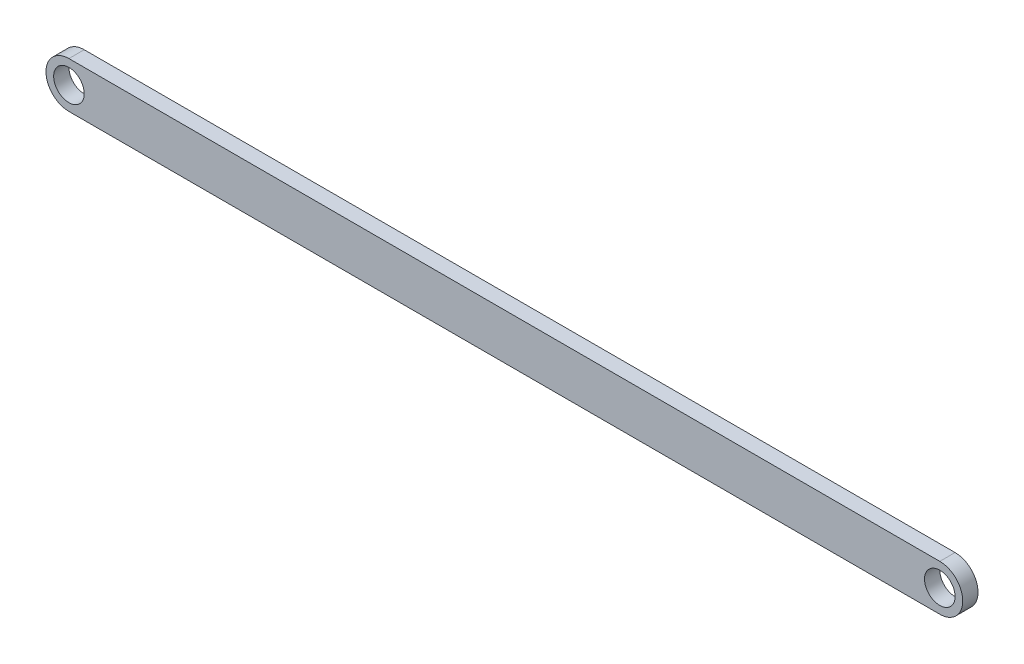
ISO-10303-21;
HEADER;
FILE_DESCRIPTION(('STEP AP214'),'2;1');
FILE_NAME('part.step','',(''),(''),'','','');
FILE_SCHEMA(('AUTOMOTIVE_DESIGN { 1 0 10303 214 1 1 1 1 }'));
ENDSEC;
DATA;
#1=APPLICATION_CONTEXT('core data for automotive mechanical design processes');
#2=APPLICATION_PROTOCOL_DEFINITION('international standard','automotive_design',2000,#1);
#3=PRODUCT_CONTEXT('',#1,'mechanical');
#4=PRODUCT('Part','Part','',(#3));
#5=PRODUCT_RELATED_PRODUCT_CATEGORY('part','',(#4));
#6=PRODUCT_DEFINITION_FORMATION('','',#4);
#7=PRODUCT_DEFINITION_CONTEXT('part definition',#1,'design');
#8=PRODUCT_DEFINITION('design','',#6,#7);
#9=PRODUCT_DEFINITION_SHAPE('','',#8);
#10=(LENGTH_UNIT() NAMED_UNIT(*) SI_UNIT(.MILLI.,.METRE.));
#11=(NAMED_UNIT(*) PLANE_ANGLE_UNIT() SI_UNIT($,.RADIAN.));
#12=(NAMED_UNIT(*) SI_UNIT($,.STERADIAN.) SOLID_ANGLE_UNIT());
#13=UNCERTAINTY_MEASURE_WITH_UNIT(LENGTH_MEASURE(1.E-05),#10,'distance_accuracy_value','');
#14=(GEOMETRIC_REPRESENTATION_CONTEXT(3) GLOBAL_UNCERTAINTY_ASSIGNED_CONTEXT((#13)) GLOBAL_UNIT_ASSIGNED_CONTEXT((#10,
#11,#12)) REPRESENTATION_CONTEXT('',''));
#15=CARTESIAN_POINT('',(0.,0.,0.));
#16=DIRECTION('',(0.,0.,1.));
#17=DIRECTION('',(1.,0.,0.));
#18=AXIS2_PLACEMENT_3D('',#15,#16,#17);
#19=CARTESIAN_POINT('',(0.,0.,10.));
#20=DIRECTION('',(0.,0.,1.));
#21=DIRECTION('',(1.,0.,0.));
#22=AXIS2_PLACEMENT_3D('',#19,#20,#21);
#23=PLANE('',#22);
#24=CARTESIAN_POINT('',(0.,0.,10.));
#25=DIRECTION('',(0.,0.,1.));
#26=DIRECTION('',(1.,0.,0.));
#27=AXIS2_PLACEMENT_3D('',#24,#25,#26);
#28=CIRCLE('',#27,10.);
#29=CARTESIAN_POINT('',(10.,0.,10.));
#30=VERTEX_POINT('',#29);
#31=EDGE_CURVE('E118',#30,#30,#28,.T.);
#32=ORIENTED_EDGE('',*,*,#31,.F.);
#33=EDGE_LOOP('',(#32));
#34=FACE_BOUND('',#33,.T.);
#35=CARTESIAN_POINT('',(0.,0.,10.));
#36=DIRECTION('',(0.,0.,1.));
#37=DIRECTION('',(1.,0.,0.));
#38=AXIS2_PLACEMENT_3D('',#35,#36,#37);
#39=CIRCLE('',#38,15.);
#40=CARTESIAN_POINT('',(0.,15.,10.));
#41=VERTEX_POINT('',#40);
#42=CARTESIAN_POINT('',(0.,-15.,10.));
#43=VERTEX_POINT('',#42);
#44=EDGE_CURVE('E98',#41,#43,#39,.T.);
#45=ORIENTED_EDGE('',*,*,#44,.T.);
#46=DIRECTION('',(1.,0.,0.));
#47=VECTOR('',#46,1.);
#48=CARTESIAN_POINT('',(0.,-15.,10.));
#49=LINE('',#48,#47);
#50=CARTESIAN_POINT('',(570.,-15.,10.));
#51=VERTEX_POINT('',#50);
#52=EDGE_CURVE('E93',#43,#51,#49,.T.);
#53=ORIENTED_EDGE('',*,*,#52,.T.);
#54=CARTESIAN_POINT('',(570.,0.,10.));
#55=DIRECTION('',(0.,0.,1.));
#56=DIRECTION('',(1.,0.,0.));
#57=AXIS2_PLACEMENT_3D('',#54,#55,#56);
#58=CIRCLE('',#57,15.);
#59=CARTESIAN_POINT('',(570.,15.,10.));
#60=VERTEX_POINT('',#59);
#61=EDGE_CURVE('E96',#51,#60,#58,.T.);
#62=ORIENTED_EDGE('',*,*,#61,.T.);
#63=DIRECTION('',(-1.,0.,0.));
#64=VECTOR('',#63,1.);
#65=CARTESIAN_POINT('',(0.,15.,10.));
#66=LINE('',#65,#64);
#67=EDGE_CURVE('E63',#60,#41,#66,.T.);
#68=ORIENTED_EDGE('',*,*,#67,.T.);
#69=EDGE_LOOP('',(#45,#53,#62,#68));
#70=FACE_BOUND('',#69,.T.);
#71=CARTESIAN_POINT('',(570.,0.,10.));
#72=DIRECTION('',(0.,0.,1.));
#73=DIRECTION('',(1.,0.,0.));
#74=AXIS2_PLACEMENT_3D('',#71,#72,#73);
#75=CIRCLE('',#74,9.99999999999998);
#76=CARTESIAN_POINT('',(580.,0.,10.));
#77=VERTEX_POINT('',#76);
#78=EDGE_CURVE('E140',#77,#77,#75,.T.);
#79=ORIENTED_EDGE('',*,*,#78,.F.);
#80=EDGE_LOOP('',(#79));
#81=FACE_BOUND('',#80,.T.);
#82=ADVANCED_FACE('F45',(#34,#70,#81),#23,.T.);
#83=CARTESIAN_POINT('',(0.,0.,0.));
#84=DIRECTION('',(0.,0.,1.));
#85=DIRECTION('',(1.,0.,0.));
#86=AXIS2_PLACEMENT_3D('',#83,#84,#85);
#87=PLANE('',#86);
#88=CARTESIAN_POINT('',(0.,0.,0.));
#89=DIRECTION('',(0.,0.,1.));
#90=DIRECTION('',(1.,0.,0.));
#91=AXIS2_PLACEMENT_3D('',#88,#89,#90);
#92=CIRCLE('',#91,15.);
#93=CARTESIAN_POINT('',(0.,15.,0.));
#94=VERTEX_POINT('',#93);
#95=CARTESIAN_POINT('',(0.,-15.,0.));
#96=VERTEX_POINT('',#95);
#97=EDGE_CURVE('E114',#94,#96,#92,.T.);
#98=ORIENTED_EDGE('',*,*,#97,.F.);
#99=DIRECTION('',(-1.,0.,0.));
#100=VECTOR('',#99,1.);
#101=CARTESIAN_POINT('',(0.,15.,0.));
#102=LINE('',#101,#100);
#103=CARTESIAN_POINT('',(570.,15.,0.));
#104=VERTEX_POINT('',#103);
#105=EDGE_CURVE('E86',#104,#94,#102,.T.);
#106=ORIENTED_EDGE('',*,*,#105,.F.);
#107=CARTESIAN_POINT('',(570.,0.,0.));
#108=DIRECTION('',(0.,0.,1.));
#109=DIRECTION('',(1.,0.,0.));
#110=AXIS2_PLACEMENT_3D('',#107,#108,#109);
#111=CIRCLE('',#110,15.);
#112=CARTESIAN_POINT('',(570.,-15.,0.));
#113=VERTEX_POINT('',#112);
#114=EDGE_CURVE('E80',#113,#104,#111,.T.);
#115=ORIENTED_EDGE('',*,*,#114,.F.);
#116=DIRECTION('',(1.,0.,0.));
#117=VECTOR('',#116,1.);
#118=CARTESIAN_POINT('',(0.,-15.,0.));
#119=LINE('',#118,#117);
#120=EDGE_CURVE('E103',#96,#113,#119,.T.);
#121=ORIENTED_EDGE('',*,*,#120,.F.);
#122=EDGE_LOOP('',(#98,#106,#115,#121));
#123=FACE_BOUND('',#122,.T.);
#124=CARTESIAN_POINT('',(0.,0.,0.));
#125=DIRECTION('',(0.,0.,1.));
#126=DIRECTION('',(1.,0.,0.));
#127=AXIS2_PLACEMENT_3D('',#124,#125,#126);
#128=CIRCLE('',#127,10.);
#129=CARTESIAN_POINT('',(10.,0.,0.));
#130=VERTEX_POINT('',#129);
#131=EDGE_CURVE('E136',#130,#130,#128,.T.);
#132=ORIENTED_EDGE('',*,*,#131,.T.);
#133=EDGE_LOOP('',(#132));
#134=FACE_BOUND('',#133,.T.);
#135=CARTESIAN_POINT('',(570.,0.,0.));
#136=DIRECTION('',(0.,0.,1.));
#137=DIRECTION('',(1.,0.,0.));
#138=AXIS2_PLACEMENT_3D('',#135,#136,#137);
#139=CIRCLE('',#138,9.99999999999998);
#140=CARTESIAN_POINT('',(580.,0.,0.));
#141=VERTEX_POINT('',#140);
#142=EDGE_CURVE('E144',#141,#141,#139,.T.);
#143=ORIENTED_EDGE('',*,*,#142,.T.);
#144=EDGE_LOOP('',(#143));
#145=FACE_BOUND('',#144,.T.);
#146=ADVANCED_FACE('F131',(#123,#134,#145),#87,.F.);
#147=CARTESIAN_POINT('',(0.,0.,10.));
#148=DIRECTION('',(0.,0.,-1.));
#149=DIRECTION('',(-1.,0.,0.));
#150=AXIS2_PLACEMENT_3D('',#147,#148,#149);
#151=CYLINDRICAL_SURFACE('',#150,15.);
#152=ORIENTED_EDGE('',*,*,#97,.T.);
#153=DIRECTION('',(0.,0.,-1.));
#154=VECTOR('',#153,1.);
#155=CARTESIAN_POINT('',(0.,-15.,10.));
#156=LINE('',#155,#154);
#157=EDGE_CURVE('E11',#43,#96,#156,.T.);
#158=ORIENTED_EDGE('',*,*,#157,.F.);
#159=ORIENTED_EDGE('',*,*,#44,.F.);
#160=DIRECTION('',(0.,0.,-1.));
#161=VECTOR('',#160,1.);
#162=CARTESIAN_POINT('',(0.,15.,10.));
#163=LINE('',#162,#161);
#164=EDGE_CURVE('E110',#41,#94,#163,.T.);
#165=ORIENTED_EDGE('',*,*,#164,.T.);
#166=EDGE_LOOP('',(#152,#158,#159,#165));
#167=FACE_BOUND('',#166,.T.);
#168=ADVANCED_FACE('F47',(#167),#151,.T.);
#169=CARTESIAN_POINT('',(0.,-15.,10.));
#170=DIRECTION('',(0.,1.,0.));
#171=DIRECTION('',(0.,0.,1.));
#172=AXIS2_PLACEMENT_3D('',#169,#170,#171);
#173=PLANE('',#172);
#174=ORIENTED_EDGE('',*,*,#120,.T.);
#175=DIRECTION('',(0.,0.,-1.));
#176=VECTOR('',#175,1.);
#177=CARTESIAN_POINT('',(570.,-15.,10.));
#178=LINE('',#177,#176);
#179=EDGE_CURVE('E55',#51,#113,#178,.T.);
#180=ORIENTED_EDGE('',*,*,#179,.F.);
#181=ORIENTED_EDGE('',*,*,#52,.F.);
#182=ORIENTED_EDGE('',*,*,#157,.T.);
#183=EDGE_LOOP('',(#174,#180,#181,#182));
#184=FACE_BOUND('',#183,.T.);
#185=ADVANCED_FACE('F102',(#184),#173,.F.);
#186=CARTESIAN_POINT('',(570.,0.,10.));
#187=DIRECTION('',(0.,0.,-1.));
#188=DIRECTION('',(-1.,0.,0.));
#189=AXIS2_PLACEMENT_3D('',#186,#187,#188);
#190=CYLINDRICAL_SURFACE('',#189,15.);
#191=ORIENTED_EDGE('',*,*,#114,.T.);
#192=DIRECTION('',(0.,0.,-1.));
#193=VECTOR('',#192,1.);
#194=CARTESIAN_POINT('',(570.,15.,10.));
#195=LINE('',#194,#193);
#196=EDGE_CURVE('E105',#60,#104,#195,.T.);
#197=ORIENTED_EDGE('',*,*,#196,.F.);
#198=ORIENTED_EDGE('',*,*,#61,.F.);
#199=ORIENTED_EDGE('',*,*,#179,.T.);
#200=EDGE_LOOP('',(#191,#197,#198,#199));
#201=FACE_BOUND('',#200,.T.);
#202=ADVANCED_FACE('F106',(#201),#190,.T.);
#203=CARTESIAN_POINT('',(0.,15.,10.));
#204=DIRECTION('',(0.,-1.,0.));
#205=DIRECTION('',(0.,0.,-1.));
#206=AXIS2_PLACEMENT_3D('',#203,#204,#205);
#207=PLANE('',#206);
#208=ORIENTED_EDGE('',*,*,#105,.T.);
#209=ORIENTED_EDGE('',*,*,#164,.F.);
#210=ORIENTED_EDGE('',*,*,#67,.F.);
#211=ORIENTED_EDGE('',*,*,#196,.T.);
#212=EDGE_LOOP('',(#208,#209,#210,#211));
#213=FACE_BOUND('',#212,.T.);
#214=ADVANCED_FACE('F128',(#213),#207,.F.);
#215=CARTESIAN_POINT('',(0.,0.,10.));
#216=DIRECTION('',(0.,0.,-1.));
#217=DIRECTION('',(-1.,0.,0.));
#218=AXIS2_PLACEMENT_3D('',#215,#216,#217);
#219=CYLINDRICAL_SURFACE('',#218,10.);
#220=ORIENTED_EDGE('',*,*,#31,.T.);
#221=EDGE_LOOP('',(#220));
#222=FACE_BOUND('',#221,.T.);
#223=ORIENTED_EDGE('',*,*,#131,.F.);
#224=EDGE_LOOP('',(#223));
#225=FACE_BOUND('',#224,.T.);
#226=ADVANCED_FACE('F163',(#222,#225),#219,.F.);
#227=CARTESIAN_POINT('',(570.,0.,10.));
#228=DIRECTION('',(0.,0.,-1.));
#229=DIRECTION('',(-1.,0.,0.));
#230=AXIS2_PLACEMENT_3D('',#227,#228,#229);
#231=CYLINDRICAL_SURFACE('',#230,9.99999999999998);
#232=ORIENTED_EDGE('',*,*,#78,.T.);
#233=EDGE_LOOP('',(#232));
#234=FACE_BOUND('',#233,.T.);
#235=ORIENTED_EDGE('',*,*,#142,.F.);
#236=EDGE_LOOP('',(#235));
#237=FACE_BOUND('',#236,.T.);
#238=ADVANCED_FACE('F152',(#234,#237),#231,.F.);
#239=CLOSED_SHELL('',(#82,#146,#168,#185,#202,#214,#226,#238));
#240=MANIFOLD_SOLID_BREP('B2',#239);
#241=ADVANCED_BREP_SHAPE_REPRESENTATION('',(#18,#240),#14);
#242=SHAPE_DEFINITION_REPRESENTATION(#9,#241);
ENDSEC;
END-ISO-10303-21;
